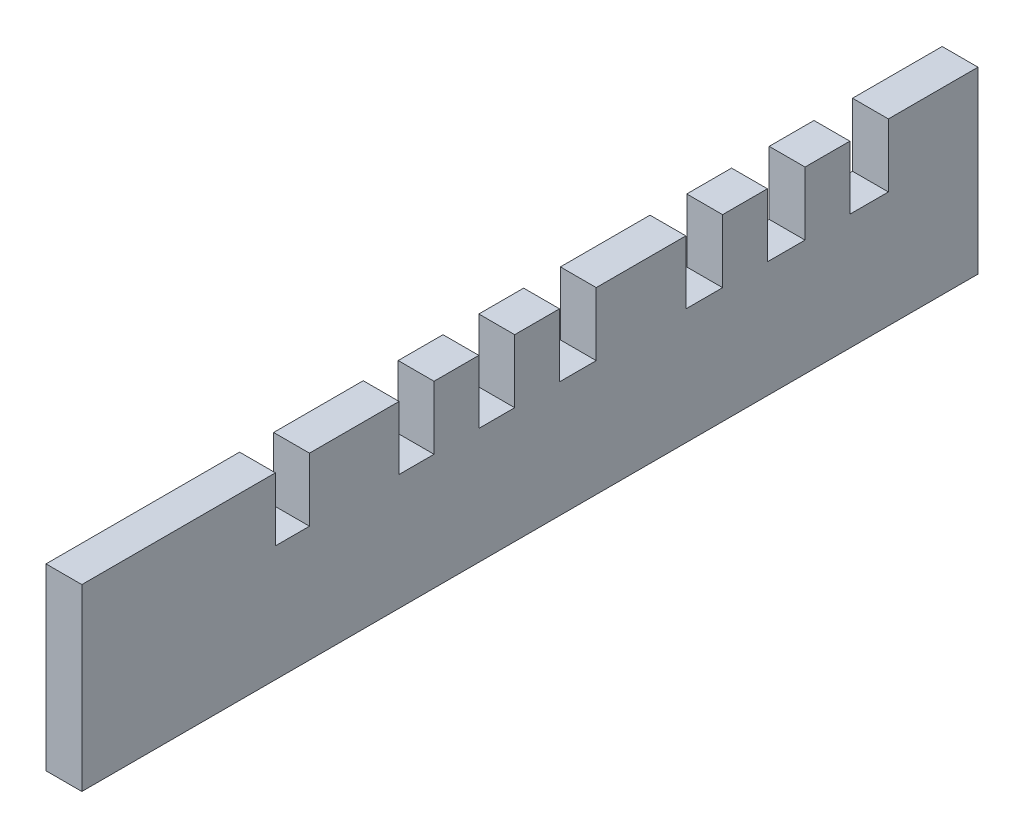
ISO-10303-21;
HEADER;
FILE_DESCRIPTION(('STEP AP214'),'2;1');
FILE_NAME('part.step','',(''),(''),'','','');
FILE_SCHEMA(('AUTOMOTIVE_DESIGN { 1 0 10303 214 1 1 1 1 }'));
ENDSEC;
DATA;
#1=APPLICATION_CONTEXT('core data for automotive mechanical design processes');
#2=APPLICATION_PROTOCOL_DEFINITION('international standard','automotive_design',2000,#1);
#3=PRODUCT_CONTEXT('',#1,'mechanical');
#4=PRODUCT('Part','Part','',(#3));
#5=PRODUCT_RELATED_PRODUCT_CATEGORY('part','',(#4));
#6=PRODUCT_DEFINITION_FORMATION('','',#4);
#7=PRODUCT_DEFINITION_CONTEXT('part definition',#1,'design');
#8=PRODUCT_DEFINITION('design','',#6,#7);
#9=PRODUCT_DEFINITION_SHAPE('','',#8);
#10=(LENGTH_UNIT() NAMED_UNIT(*) SI_UNIT(.MILLI.,.METRE.));
#11=(NAMED_UNIT(*) PLANE_ANGLE_UNIT() SI_UNIT($,.RADIAN.));
#12=(NAMED_UNIT(*) SI_UNIT($,.STERADIAN.) SOLID_ANGLE_UNIT());
#13=UNCERTAINTY_MEASURE_WITH_UNIT(LENGTH_MEASURE(1.E-05),#10,'distance_accuracy_value','');
#14=(GEOMETRIC_REPRESENTATION_CONTEXT(3) GLOBAL_UNCERTAINTY_ASSIGNED_CONTEXT((#13)) GLOBAL_UNIT_ASSIGNED_CONTEXT((#10,
#11,#12)) REPRESENTATION_CONTEXT('',''));
#15=CARTESIAN_POINT('',(0.,0.,0.));
#16=DIRECTION('',(0.,0.,1.));
#17=DIRECTION('',(1.,0.,0.));
#18=AXIS2_PLACEMENT_3D('',#15,#16,#17);
#19=CARTESIAN_POINT('',(0.,25.4,127.));
#20=DIRECTION('',(0.,-1.,0.));
#21=DIRECTION('',(0.,0.,-1.));
#22=AXIS2_PLACEMENT_3D('',#19,#20,#21);
#23=PLANE('',#22);
#24=DIRECTION('',(0.,0.,-1.));
#25=VECTOR('',#24,1.);
#26=CARTESIAN_POINT('',(0.,25.4,127.));
#27=LINE('',#26,#25);
#28=CARTESIAN_POINT('',(0.,25.4,12.7));
#29=VERTEX_POINT('',#28);
#30=CARTESIAN_POINT('',(0.,25.4,0.));
#31=VERTEX_POINT('',#30);
#32=EDGE_CURVE('E272',#29,#31,#27,.T.);
#33=ORIENTED_EDGE('',*,*,#32,.F.);
#34=DIRECTION('',(1.,0.,0.));
#35=VECTOR('',#34,1.);
#36=CARTESIAN_POINT('',(0.,25.4,12.7));
#37=LINE('',#36,#35);
#38=CARTESIAN_POINT('',(5.08,25.4,12.7));
#39=VERTEX_POINT('',#38);
#40=EDGE_CURVE('E12',#29,#39,#37,.T.);
#41=ORIENTED_EDGE('',*,*,#40,.T.);
#42=DIRECTION('',(0.,0.,-1.));
#43=VECTOR('',#42,1.);
#44=CARTESIAN_POINT('',(5.08,25.4,127.));
#45=LINE('',#44,#43);
#46=CARTESIAN_POINT('',(5.08,25.4,0.));
#47=VERTEX_POINT('',#46);
#48=EDGE_CURVE('E270',#39,#47,#45,.T.);
#49=ORIENTED_EDGE('',*,*,#48,.T.);
#50=DIRECTION('',(-1.,0.,0.));
#51=VECTOR('',#50,1.);
#52=CARTESIAN_POINT('',(0.,25.4,0.));
#53=LINE('',#52,#51);
#54=EDGE_CURVE('E482',#47,#31,#53,.T.);
#55=ORIENTED_EDGE('',*,*,#54,.T.);
#56=EDGE_LOOP('',(#33,#41,#49,#55));
#57=FACE_BOUND('',#56,.T.);
#58=ADVANCED_FACE('F44',(#57),#23,.F.);
#59=CARTESIAN_POINT('',(5.08,25.4,24.511));
#60=VERTEX_POINT('',#59);
#61=CARTESIAN_POINT('',(5.08,25.4,18.161));
#62=VERTEX_POINT('',#61);
#63=EDGE_CURVE('E279',#60,#62,#45,.T.);
#64=ORIENTED_EDGE('',*,*,#63,.T.);
#65=DIRECTION('',(-1.,0.,0.));
#66=VECTOR('',#65,1.);
#67=CARTESIAN_POINT('',(0.,25.4,18.161));
#68=LINE('',#67,#66);
#69=CARTESIAN_POINT('',(0.,25.4,18.161));
#70=VERTEX_POINT('',#69);
#71=EDGE_CURVE('E52',#62,#70,#68,.T.);
#72=ORIENTED_EDGE('',*,*,#71,.T.);
#73=CARTESIAN_POINT('',(0.,25.4,24.511));
#74=VERTEX_POINT('',#73);
#75=EDGE_CURVE('E595',#74,#70,#27,.T.);
#76=ORIENTED_EDGE('',*,*,#75,.F.);
#77=DIRECTION('',(1.,0.,0.));
#78=VECTOR('',#77,1.);
#79=CARTESIAN_POINT('',(0.,25.4,24.511));
#80=LINE('',#79,#78);
#81=EDGE_CURVE('E589',#74,#60,#80,.T.);
#82=ORIENTED_EDGE('',*,*,#81,.T.);
#83=EDGE_LOOP('',(#64,#72,#76,#82));
#84=FACE_BOUND('',#83,.T.);
#85=ADVANCED_FACE('F594',(#84),#23,.F.);
#86=CARTESIAN_POINT('',(5.08,25.4,36.195));
#87=VERTEX_POINT('',#86);
#88=CARTESIAN_POINT('',(5.08,25.4,29.845));
#89=VERTEX_POINT('',#88);
#90=EDGE_CURVE('E285',#87,#89,#45,.T.);
#91=ORIENTED_EDGE('',*,*,#90,.T.);
#92=DIRECTION('',(-1.,0.,0.));
#93=VECTOR('',#92,1.);
#94=CARTESIAN_POINT('',(0.,25.4,29.845));
#95=LINE('',#94,#93);
#96=CARTESIAN_POINT('',(0.,25.4,29.845));
#97=VERTEX_POINT('',#96);
#98=EDGE_CURVE('E347',#89,#97,#95,.T.);
#99=ORIENTED_EDGE('',*,*,#98,.T.);
#100=CARTESIAN_POINT('',(0.,25.4,36.195));
#101=VERTEX_POINT('',#100);
#102=EDGE_CURVE('E600',#101,#97,#27,.T.);
#103=ORIENTED_EDGE('',*,*,#102,.F.);
#104=DIRECTION('',(1.,0.,0.));
#105=VECTOR('',#104,1.);
#106=CARTESIAN_POINT('',(0.,25.4,36.195));
#107=LINE('',#106,#105);
#108=EDGE_CURVE('E349',#101,#87,#107,.T.);
#109=ORIENTED_EDGE('',*,*,#108,.T.);
#110=EDGE_LOOP('',(#91,#99,#103,#109));
#111=FACE_BOUND('',#110,.T.);
#112=ADVANCED_FACE('F345',(#111),#23,.F.);
#113=CARTESIAN_POINT('',(5.08,25.4,54.102));
#114=VERTEX_POINT('',#113);
#115=CARTESIAN_POINT('',(5.08,25.4,41.402));
#116=VERTEX_POINT('',#115);
#117=EDGE_CURVE('E323',#114,#116,#45,.T.);
#118=ORIENTED_EDGE('',*,*,#117,.T.);
#119=DIRECTION('',(-1.,0.,0.));
#120=VECTOR('',#119,1.);
#121=CARTESIAN_POINT('',(0.,25.4,41.402));
#122=LINE('',#121,#120);
#123=CARTESIAN_POINT('',(0.,25.4,41.402));
#124=VERTEX_POINT('',#123);
#125=EDGE_CURVE('E585',#116,#124,#122,.T.);
#126=ORIENTED_EDGE('',*,*,#125,.T.);
#127=CARTESIAN_POINT('',(0.,25.4,54.102));
#128=VERTEX_POINT('',#127);
#129=EDGE_CURVE('E601',#128,#124,#27,.T.);
#130=ORIENTED_EDGE('',*,*,#129,.F.);
#131=DIRECTION('',(1.,0.,0.));
#132=VECTOR('',#131,1.);
#133=CARTESIAN_POINT('',(0.,25.4,54.102));
#134=LINE('',#133,#132);
#135=EDGE_CURVE('E583',#128,#114,#134,.T.);
#136=ORIENTED_EDGE('',*,*,#135,.T.);
#137=EDGE_LOOP('',(#118,#126,#130,#136));
#138=FACE_BOUND('',#137,.T.);
#139=ADVANCED_FACE('F645',(#138),#23,.F.);
#140=CARTESIAN_POINT('',(5.08,25.4,65.659));
#141=VERTEX_POINT('',#140);
#142=CARTESIAN_POINT('',(5.08,25.4,59.309));
#143=VERTEX_POINT('',#142);
#144=EDGE_CURVE('E314',#141,#143,#45,.T.);
#145=ORIENTED_EDGE('',*,*,#144,.T.);
#146=DIRECTION('',(-1.,0.,0.));
#147=VECTOR('',#146,1.);
#148=CARTESIAN_POINT('',(0.,25.4,59.309));
#149=LINE('',#148,#147);
#150=CARTESIAN_POINT('',(0.,25.4,59.309));
#151=VERTEX_POINT('',#150);
#152=EDGE_CURVE('E581',#143,#151,#149,.T.);
#153=ORIENTED_EDGE('',*,*,#152,.T.);
#154=CARTESIAN_POINT('',(0.,25.4,65.659));
#155=VERTEX_POINT('',#154);
#156=EDGE_CURVE('E647',#155,#151,#27,.T.);
#157=ORIENTED_EDGE('',*,*,#156,.F.);
#158=DIRECTION('',(1.,0.,0.));
#159=VECTOR('',#158,1.);
#160=CARTESIAN_POINT('',(0.,25.4,65.659));
#161=LINE('',#160,#159);
#162=EDGE_CURVE('E579',#155,#141,#161,.T.);
#163=ORIENTED_EDGE('',*,*,#162,.T.);
#164=EDGE_LOOP('',(#145,#153,#157,#163));
#165=FACE_BOUND('',#164,.T.);
#166=ADVANCED_FACE('F663',(#165),#23,.F.);
#167=CARTESIAN_POINT('',(5.08,25.4,77.089));
#168=VERTEX_POINT('',#167);
#169=CARTESIAN_POINT('',(5.08,25.4,70.739));
#170=VERTEX_POINT('',#169);
#171=EDGE_CURVE('E305',#168,#170,#45,.T.);
#172=ORIENTED_EDGE('',*,*,#171,.T.);
#173=DIRECTION('',(-1.,0.,0.));
#174=VECTOR('',#173,1.);
#175=CARTESIAN_POINT('',(0.,25.4,70.739));
#176=LINE('',#175,#174);
#177=CARTESIAN_POINT('',(0.,25.4,70.739));
#178=VERTEX_POINT('',#177);
#179=EDGE_CURVE('E572',#170,#178,#176,.T.);
#180=ORIENTED_EDGE('',*,*,#179,.T.);
#181=CARTESIAN_POINT('',(0.,25.4,77.089));
#182=VERTEX_POINT('',#181);
#183=EDGE_CURVE('E649',#182,#178,#27,.T.);
#184=ORIENTED_EDGE('',*,*,#183,.F.);
#185=DIRECTION('',(1.,0.,0.));
#186=VECTOR('',#185,1.);
#187=CARTESIAN_POINT('',(0.,25.4,77.089));
#188=LINE('',#187,#186);
#189=EDGE_CURVE('E569',#182,#168,#188,.T.);
#190=ORIENTED_EDGE('',*,*,#189,.T.);
#191=EDGE_LOOP('',(#172,#180,#184,#190));
#192=FACE_BOUND('',#191,.T.);
#193=ADVANCED_FACE('F655',(#192),#23,.F.);
#194=CARTESIAN_POINT('',(5.08,25.4,94.742));
#195=VERTEX_POINT('',#194);
#196=CARTESIAN_POINT('',(5.08,25.4,82.042));
#197=VERTEX_POINT('',#196);
#198=EDGE_CURVE('E294',#195,#197,#45,.T.);
#199=ORIENTED_EDGE('',*,*,#198,.T.);
#200=DIRECTION('',(-1.,0.,0.));
#201=VECTOR('',#200,1.);
#202=CARTESIAN_POINT('',(0.,25.4,82.042));
#203=LINE('',#202,#201);
#204=CARTESIAN_POINT('',(0.,25.4,82.042));
#205=VERTEX_POINT('',#204);
#206=EDGE_CURVE('E566',#197,#205,#203,.T.);
#207=ORIENTED_EDGE('',*,*,#206,.T.);
#208=CARTESIAN_POINT('',(0.,25.4,94.742));
#209=VERTEX_POINT('',#208);
#210=EDGE_CURVE('E287',#209,#205,#27,.T.);
#211=ORIENTED_EDGE('',*,*,#210,.F.);
#212=DIRECTION('',(1.,0.,0.));
#213=VECTOR('',#212,1.);
#214=CARTESIAN_POINT('',(0.,25.4,94.742));
#215=LINE('',#214,#213);
#216=EDGE_CURVE('E570',#209,#195,#215,.T.);
#217=ORIENTED_EDGE('',*,*,#216,.T.);
#218=EDGE_LOOP('',(#199,#207,#211,#217));
#219=FACE_BOUND('',#218,.T.);
#220=ADVANCED_FACE('F653',(#219),#23,.F.);
#221=CARTESIAN_POINT('',(0.,0.,127.));
#222=DIRECTION('',(1.,0.,0.));
#223=DIRECTION('',(0.,0.,-1.));
#224=AXIS2_PLACEMENT_3D('',#221,#222,#223);
#225=PLANE('',#224);
#226=DIRECTION('',(0.,0.,-1.));
#227=VECTOR('',#226,1.);
#228=CARTESIAN_POINT('',(0.,16.4345145057894,127.));
#229=LINE('',#228,#227);
#230=CARTESIAN_POINT('',(0.,16.4345145057894,18.161));
#231=VERTEX_POINT('',#230);
#232=CARTESIAN_POINT('',(0.,16.4345145057894,12.7));
#233=VERTEX_POINT('',#232);
#234=EDGE_CURVE('E478',#231,#233,#229,.T.);
#235=ORIENTED_EDGE('',*,*,#234,.T.);
#236=DIRECTION('',(0.,1.,0.));
#237=VECTOR('',#236,1.);
#238=CARTESIAN_POINT('',(0.,0.,12.7));
#239=LINE('',#238,#237);
#240=EDGE_CURVE('E510',#233,#29,#239,.T.);
#241=ORIENTED_EDGE('',*,*,#240,.T.);
#242=ORIENTED_EDGE('',*,*,#32,.T.);
#243=DIRECTION('',(0.,-1.,0.));
#244=VECTOR('',#243,1.);
#245=CARTESIAN_POINT('',(0.,0.,0.));
#246=LINE('',#245,#244);
#247=CARTESIAN_POINT('',(0.,0.,0.));
#248=VERTEX_POINT('',#247);
#249=EDGE_CURVE('E474',#31,#248,#246,.T.);
#250=ORIENTED_EDGE('',*,*,#249,.T.);
#251=DIRECTION('',(0.,0.,-1.));
#252=VECTOR('',#251,1.);
#253=CARTESIAN_POINT('',(0.,0.,127.));
#254=LINE('',#253,#252);
#255=CARTESIAN_POINT('',(0.,0.,127.));
#256=VERTEX_POINT('',#255);
#257=EDGE_CURVE('E302',#256,#248,#254,.T.);
#258=ORIENTED_EDGE('',*,*,#257,.F.);
#259=DIRECTION('',(0.,-1.,0.));
#260=VECTOR('',#259,1.);
#261=CARTESIAN_POINT('',(0.,0.,127.));
#262=LINE('',#261,#260);
#263=CARTESIAN_POINT('',(0.,25.4,127.));
#264=VERTEX_POINT('',#263);
#265=EDGE_CURVE('E483',#264,#256,#262,.T.);
#266=ORIENTED_EDGE('',*,*,#265,.F.);
#267=CARTESIAN_POINT('',(0.,25.4,99.568));
#268=VERTEX_POINT('',#267);
#269=EDGE_CURVE('E280',#264,#268,#27,.T.);
#270=ORIENTED_EDGE('',*,*,#269,.T.);
#271=DIRECTION('',(0.,-1.,0.));
#272=VECTOR('',#271,1.);
#273=CARTESIAN_POINT('',(0.,0.,99.568));
#274=LINE('',#273,#272);
#275=CARTESIAN_POINT('',(0.,16.4345145057894,99.568));
#276=VERTEX_POINT('',#275);
#277=EDGE_CURVE('E544',#268,#276,#274,.T.);
#278=ORIENTED_EDGE('',*,*,#277,.T.);
#279=DIRECTION('',(0.,0.,-1.));
#280=VECTOR('',#279,1.);
#281=CARTESIAN_POINT('',(0.,16.4345145057894,127.));
#282=LINE('',#281,#280);
#283=CARTESIAN_POINT('',(0.,16.4345145057894,94.742));
#284=VERTEX_POINT('',#283);
#285=EDGE_CURVE('E507',#276,#284,#282,.T.);
#286=ORIENTED_EDGE('',*,*,#285,.T.);
#287=DIRECTION('',(0.,1.,0.));
#288=VECTOR('',#287,1.);
#289=CARTESIAN_POINT('',(0.,0.,94.742));
#290=LINE('',#289,#288);
#291=EDGE_CURVE('E541',#284,#209,#290,.T.);
#292=ORIENTED_EDGE('',*,*,#291,.T.);
#293=ORIENTED_EDGE('',*,*,#210,.T.);
#294=DIRECTION('',(0.,-1.,0.));
#295=VECTOR('',#294,1.);
#296=CARTESIAN_POINT('',(0.,0.,82.0419999999999));
#297=LINE('',#296,#295);
#298=CARTESIAN_POINT('',(0.,16.4345145057894,82.042));
#299=VERTEX_POINT('',#298);
#300=EDGE_CURVE('E538',#205,#299,#297,.T.);
#301=ORIENTED_EDGE('',*,*,#300,.T.);
#302=DIRECTION('',(0.,0.,-1.));
#303=VECTOR('',#302,1.);
#304=CARTESIAN_POINT('',(0.,16.4345145057894,127.));
#305=LINE('',#304,#303);
#306=CARTESIAN_POINT('',(0.,16.4345145057894,77.089));
#307=VERTEX_POINT('',#306);
#308=EDGE_CURVE('E504',#299,#307,#305,.T.);
#309=ORIENTED_EDGE('',*,*,#308,.T.);
#310=DIRECTION('',(0.,1.,0.));
#311=VECTOR('',#310,1.);
#312=CARTESIAN_POINT('',(0.,0.,77.089));
#313=LINE('',#312,#311);
#314=EDGE_CURVE('E535',#307,#182,#313,.T.);
#315=ORIENTED_EDGE('',*,*,#314,.T.);
#316=ORIENTED_EDGE('',*,*,#183,.T.);
#317=DIRECTION('',(0.,-1.,0.));
#318=VECTOR('',#317,1.);
#319=CARTESIAN_POINT('',(0.,0.,70.739));
#320=LINE('',#319,#318);
#321=CARTESIAN_POINT('',(0.,16.4345145057894,70.739));
#322=VERTEX_POINT('',#321);
#323=EDGE_CURVE('E532',#178,#322,#320,.T.);
#324=ORIENTED_EDGE('',*,*,#323,.T.);
#325=DIRECTION('',(0.,0.,-1.));
#326=VECTOR('',#325,1.);
#327=CARTESIAN_POINT('',(0.,16.4345145057894,127.));
#328=LINE('',#327,#326);
#329=CARTESIAN_POINT('',(0.,16.4345145057894,65.659));
#330=VERTEX_POINT('',#329);
#331=EDGE_CURVE('E501',#322,#330,#328,.T.);
#332=ORIENTED_EDGE('',*,*,#331,.T.);
#333=DIRECTION('',(0.,1.,0.));
#334=VECTOR('',#333,1.);
#335=CARTESIAN_POINT('',(0.,0.,65.659));
#336=LINE('',#335,#334);
#337=EDGE_CURVE('E529',#330,#155,#336,.T.);
#338=ORIENTED_EDGE('',*,*,#337,.T.);
#339=ORIENTED_EDGE('',*,*,#156,.T.);
#340=DIRECTION('',(0.,-1.,0.));
#341=VECTOR('',#340,1.);
#342=CARTESIAN_POINT('',(0.,0.,59.309));
#343=LINE('',#342,#341);
#344=CARTESIAN_POINT('',(0.,16.4345145057894,59.309));
#345=VERTEX_POINT('',#344);
#346=EDGE_CURVE('E526',#151,#345,#343,.T.);
#347=ORIENTED_EDGE('',*,*,#346,.T.);
#348=DIRECTION('',(0.,0.,-1.));
#349=VECTOR('',#348,1.);
#350=CARTESIAN_POINT('',(0.,16.4345145057894,127.));
#351=LINE('',#350,#349);
#352=CARTESIAN_POINT('',(0.,16.4345145057894,54.102));
#353=VERTEX_POINT('',#352);
#354=EDGE_CURVE('E498',#345,#353,#351,.T.);
#355=ORIENTED_EDGE('',*,*,#354,.T.);
#356=DIRECTION('',(0.,1.,0.));
#357=VECTOR('',#356,1.);
#358=CARTESIAN_POINT('',(0.,0.,54.102));
#359=LINE('',#358,#357);
#360=EDGE_CURVE('E523',#353,#128,#359,.T.);
#361=ORIENTED_EDGE('',*,*,#360,.T.);
#362=ORIENTED_EDGE('',*,*,#129,.T.);
#363=DIRECTION('',(0.,-1.,0.));
#364=VECTOR('',#363,1.);
#365=CARTESIAN_POINT('',(0.,0.,41.402));
#366=LINE('',#365,#364);
#367=CARTESIAN_POINT('',(0.,16.4345145057894,41.402));
#368=VERTEX_POINT('',#367);
#369=EDGE_CURVE('E520',#124,#368,#366,.T.);
#370=ORIENTED_EDGE('',*,*,#369,.T.);
#371=DIRECTION('',(0.,0.,-1.));
#372=VECTOR('',#371,1.);
#373=CARTESIAN_POINT('',(0.,16.4345145057894,127.));
#374=LINE('',#373,#372);
#375=CARTESIAN_POINT('',(0.,16.4345145057894,36.195));
#376=VERTEX_POINT('',#375);
#377=EDGE_CURVE('E495',#368,#376,#374,.T.);
#378=ORIENTED_EDGE('',*,*,#377,.T.);
#379=DIRECTION('',(0.,1.,0.));
#380=VECTOR('',#379,1.);
#381=CARTESIAN_POINT('',(0.,0.,36.195));
#382=LINE('',#381,#380);
#383=EDGE_CURVE('E517',#376,#101,#382,.T.);
#384=ORIENTED_EDGE('',*,*,#383,.T.);
#385=ORIENTED_EDGE('',*,*,#102,.T.);
#386=DIRECTION('',(0.,-1.,0.));
#387=VECTOR('',#386,1.);
#388=CARTESIAN_POINT('',(0.,0.,29.845));
#389=LINE('',#388,#387);
#390=CARTESIAN_POINT('',(0.,16.4345145057894,29.845));
#391=VERTEX_POINT('',#390);
#392=EDGE_CURVE('E67',#97,#391,#389,.T.);
#393=ORIENTED_EDGE('',*,*,#392,.T.);
#394=DIRECTION('',(0.,0.,-1.));
#395=VECTOR('',#394,1.);
#396=CARTESIAN_POINT('',(0.,16.4345145057894,127.));
#397=LINE('',#396,#395);
#398=CARTESIAN_POINT('',(0.,16.4345145057894,24.511));
#399=VERTEX_POINT('',#398);
#400=EDGE_CURVE('E492',#391,#399,#397,.T.);
#401=ORIENTED_EDGE('',*,*,#400,.T.);
#402=DIRECTION('',(0.,1.,0.));
#403=VECTOR('',#402,1.);
#404=CARTESIAN_POINT('',(0.,0.,24.511));
#405=LINE('',#404,#403);
#406=EDGE_CURVE('E513',#399,#74,#405,.T.);
#407=ORIENTED_EDGE('',*,*,#406,.T.);
#408=ORIENTED_EDGE('',*,*,#75,.T.);
#409=DIRECTION('',(0.,-1.,0.));
#410=VECTOR('',#409,1.);
#411=CARTESIAN_POINT('',(0.,0.,18.161));
#412=LINE('',#411,#410);
#413=EDGE_CURVE('E59',#70,#231,#412,.T.);
#414=ORIENTED_EDGE('',*,*,#413,.T.);
#415=EDGE_LOOP('',(#235,#241,#242,#250,#258,#266,#270,#278,#286,#292,#293,#301,#309,#315,#316,
#324,#332,#338,#339,#347,#355,#361,#362,#370,#378,#384,#385,#393,#401,#407,#408,#414));
#416=FACE_BOUND('',#415,.T.);
#417=ADVANCED_FACE('F46',(#416),#225,.F.);
#418=CARTESIAN_POINT('',(0.,0.,127.));
#419=DIRECTION('',(0.,1.,0.));
#420=DIRECTION('',(0.,0.,1.));
#421=AXIS2_PLACEMENT_3D('',#418,#419,#420);
#422=PLANE('',#421);
#423=DIRECTION('',(1.,0.,0.));
#424=VECTOR('',#423,1.);
#425=CARTESIAN_POINT('',(0.,0.,0.));
#426=LINE('',#425,#424);
#427=CARTESIAN_POINT('',(5.08,0.,0.));
#428=VERTEX_POINT('',#427);
#429=EDGE_CURVE('E477',#248,#428,#426,.T.);
#430=ORIENTED_EDGE('',*,*,#429,.T.);
#431=DIRECTION('',(0.,0.,-1.));
#432=VECTOR('',#431,1.);
#433=CARTESIAN_POINT('',(5.08,0.,127.));
#434=LINE('',#433,#432);
#435=CARTESIAN_POINT('',(5.08,0.,127.));
#436=VERTEX_POINT('',#435);
#437=EDGE_CURVE('E293',#436,#428,#434,.T.);
#438=ORIENTED_EDGE('',*,*,#437,.F.);
#439=DIRECTION('',(1.,0.,0.));
#440=VECTOR('',#439,1.);
#441=CARTESIAN_POINT('',(0.,0.,127.));
#442=LINE('',#441,#440);
#443=EDGE_CURVE('E471',#256,#436,#442,.T.);
#444=ORIENTED_EDGE('',*,*,#443,.F.);
#445=ORIENTED_EDGE('',*,*,#257,.T.);
#446=EDGE_LOOP('',(#430,#438,#444,#445));
#447=FACE_BOUND('',#446,.T.);
#448=ADVANCED_FACE('F662',(#447),#422,.F.);
#449=CARTESIAN_POINT('',(5.08,0.,127.));
#450=DIRECTION('',(-1.,0.,0.));
#451=DIRECTION('',(0.,0.,1.));
#452=AXIS2_PLACEMENT_3D('',#449,#450,#451);
#453=PLANE('',#452);
#454=ORIENTED_EDGE('',*,*,#48,.F.);
#455=DIRECTION('',(0.,1.,0.));
#456=VECTOR('',#455,1.);
#457=CARTESIAN_POINT('',(5.08,25.4,12.7));
#458=LINE('',#457,#456);
#459=CARTESIAN_POINT('',(5.08,16.4345145057894,12.7));
#460=VERTEX_POINT('',#459);
#461=EDGE_CURVE('E254',#460,#39,#458,.T.);
#462=ORIENTED_EDGE('',*,*,#461,.F.);
#463=DIRECTION('',(0.,0.,-1.));
#464=VECTOR('',#463,1.);
#465=CARTESIAN_POINT('',(5.08,16.4345145057894,12.7));
#466=LINE('',#465,#464);
#467=CARTESIAN_POINT('',(5.08,16.4345145057894,18.161));
#468=VERTEX_POINT('',#467);
#469=EDGE_CURVE('E604',#468,#460,#466,.T.);
#470=ORIENTED_EDGE('',*,*,#469,.F.);
#471=DIRECTION('',(0.,-1.,0.));
#472=VECTOR('',#471,1.);
#473=CARTESIAN_POINT('',(5.08,25.4,18.161));
#474=LINE('',#473,#472);
#475=EDGE_CURVE('E264',#62,#468,#474,.T.);
#476=ORIENTED_EDGE('',*,*,#475,.F.);
#477=ORIENTED_EDGE('',*,*,#63,.F.);
#478=DIRECTION('',(0.,1.,0.));
#479=VECTOR('',#478,1.);
#480=CARTESIAN_POINT('',(5.08,25.4,24.511));
#481=LINE('',#480,#479);
#482=CARTESIAN_POINT('',(5.08,16.4345145057894,24.511));
#483=VERTEX_POINT('',#482);
#484=EDGE_CURVE('E360',#483,#60,#481,.T.);
#485=ORIENTED_EDGE('',*,*,#484,.F.);
#486=DIRECTION('',(0.,0.,-1.));
#487=VECTOR('',#486,1.);
#488=CARTESIAN_POINT('',(5.08,16.4345145057894,24.511));
#489=LINE('',#488,#487);
#490=CARTESIAN_POINT('',(5.08,16.4345145057894,29.845));
#491=VERTEX_POINT('',#490);
#492=EDGE_CURVE('E359',#491,#483,#489,.T.);
#493=ORIENTED_EDGE('',*,*,#492,.F.);
#494=DIRECTION('',(0.,-1.,0.));
#495=VECTOR('',#494,1.);
#496=CARTESIAN_POINT('',(5.08,25.4,29.845));
#497=LINE('',#496,#495);
#498=EDGE_CURVE('E356',#89,#491,#497,.T.);
#499=ORIENTED_EDGE('',*,*,#498,.F.);
#500=ORIENTED_EDGE('',*,*,#90,.F.);
#501=DIRECTION('',(0.,1.,0.));
#502=VECTOR('',#501,1.);
#503=CARTESIAN_POINT('',(5.08,25.4,36.195));
#504=LINE('',#503,#502);
#505=CARTESIAN_POINT('',(5.08,16.4345145057894,36.195));
#506=VERTEX_POINT('',#505);
#507=EDGE_CURVE('E353',#506,#87,#504,.T.);
#508=ORIENTED_EDGE('',*,*,#507,.F.);
#509=DIRECTION('',(0.,0.,-1.));
#510=VECTOR('',#509,1.);
#511=CARTESIAN_POINT('',(5.08,16.4345145057894,36.195));
#512=LINE('',#511,#510);
#513=CARTESIAN_POINT('',(5.08,16.4345145057894,41.402));
#514=VERTEX_POINT('',#513);
#515=EDGE_CURVE('E389',#514,#506,#512,.T.);
#516=ORIENTED_EDGE('',*,*,#515,.F.);
#517=DIRECTION('',(0.,-1.,0.));
#518=VECTOR('',#517,1.);
#519=CARTESIAN_POINT('',(5.08,25.4,41.402));
#520=LINE('',#519,#518);
#521=EDGE_CURVE('E385',#116,#514,#520,.T.);
#522=ORIENTED_EDGE('',*,*,#521,.F.);
#523=ORIENTED_EDGE('',*,*,#117,.F.);
#524=DIRECTION('',(0.,1.,0.));
#525=VECTOR('',#524,1.);
#526=CARTESIAN_POINT('',(5.08,25.4,54.102));
#527=LINE('',#526,#525);
#528=CARTESIAN_POINT('',(5.08,16.4345145057894,54.102));
#529=VERTEX_POINT('',#528);
#530=EDGE_CURVE('E398',#529,#114,#527,.T.);
#531=ORIENTED_EDGE('',*,*,#530,.F.);
#532=DIRECTION('',(0.,0.,-1.));
#533=VECTOR('',#532,1.);
#534=CARTESIAN_POINT('',(5.08,16.4345145057894,54.102));
#535=LINE('',#534,#533);
#536=CARTESIAN_POINT('',(5.08,16.4345145057894,59.309));
#537=VERTEX_POINT('',#536);
#538=EDGE_CURVE('E407',#537,#529,#535,.T.);
#539=ORIENTED_EDGE('',*,*,#538,.F.);
#540=DIRECTION('',(0.,-1.,0.));
#541=VECTOR('',#540,1.);
#542=CARTESIAN_POINT('',(5.08,25.4,59.309));
#543=LINE('',#542,#541);
#544=EDGE_CURVE('E402',#143,#537,#543,.T.);
#545=ORIENTED_EDGE('',*,*,#544,.F.);
#546=ORIENTED_EDGE('',*,*,#144,.F.);
#547=DIRECTION('',(0.,1.,0.));
#548=VECTOR('',#547,1.);
#549=CARTESIAN_POINT('',(5.08,25.4,65.659));
#550=LINE('',#549,#548);
#551=CARTESIAN_POINT('',(5.08,16.4345145057894,65.659));
#552=VERTEX_POINT('',#551);
#553=EDGE_CURVE('E416',#552,#141,#550,.T.);
#554=ORIENTED_EDGE('',*,*,#553,.F.);
#555=DIRECTION('',(0.,0.,-1.));
#556=VECTOR('',#555,1.);
#557=CARTESIAN_POINT('',(5.08,16.4345145057894,65.659));
#558=LINE('',#557,#556);
#559=CARTESIAN_POINT('',(5.08,16.4345145057894,70.739));
#560=VERTEX_POINT('',#559);
#561=EDGE_CURVE('E425',#560,#552,#558,.T.);
#562=ORIENTED_EDGE('',*,*,#561,.F.);
#563=DIRECTION('',(0.,-1.,0.));
#564=VECTOR('',#563,1.);
#565=CARTESIAN_POINT('',(5.08,25.4,70.739));
#566=LINE('',#565,#564);
#567=EDGE_CURVE('E420',#170,#560,#566,.T.);
#568=ORIENTED_EDGE('',*,*,#567,.F.);
#569=ORIENTED_EDGE('',*,*,#171,.F.);
#570=DIRECTION('',(0.,1.,0.));
#571=VECTOR('',#570,1.);
#572=CARTESIAN_POINT('',(5.08,25.4,77.089));
#573=LINE('',#572,#571);
#574=CARTESIAN_POINT('',(5.08,16.4345145057894,77.089));
#575=VERTEX_POINT('',#574);
#576=EDGE_CURVE('E434',#575,#168,#573,.T.);
#577=ORIENTED_EDGE('',*,*,#576,.F.);
#578=DIRECTION('',(0.,0.,-1.));
#579=VECTOR('',#578,1.);
#580=CARTESIAN_POINT('',(5.08,16.4345145057894,77.089));
#581=LINE('',#580,#579);
#582=CARTESIAN_POINT('',(5.08,16.4345145057894,82.042));
#583=VERTEX_POINT('',#582);
#584=EDGE_CURVE('E443',#583,#575,#581,.T.);
#585=ORIENTED_EDGE('',*,*,#584,.F.);
#586=DIRECTION('',(0.,-1.,0.));
#587=VECTOR('',#586,1.);
#588=CARTESIAN_POINT('',(5.08,25.4,82.042));
#589=LINE('',#588,#587);
#590=EDGE_CURVE('E438',#197,#583,#589,.T.);
#591=ORIENTED_EDGE('',*,*,#590,.F.);
#592=ORIENTED_EDGE('',*,*,#198,.F.);
#593=DIRECTION('',(0.,1.,0.));
#594=VECTOR('',#593,1.);
#595=CARTESIAN_POINT('',(5.08,25.4,94.742));
#596=LINE('',#595,#594);
#597=CARTESIAN_POINT('',(5.08,16.4345145057894,94.742));
#598=VERTEX_POINT('',#597);
#599=EDGE_CURVE('E452',#598,#195,#596,.T.);
#600=ORIENTED_EDGE('',*,*,#599,.F.);
#601=DIRECTION('',(0.,0.,-1.));
#602=VECTOR('',#601,1.);
#603=CARTESIAN_POINT('',(5.08,16.4345145057894,94.742));
#604=LINE('',#603,#602);
#605=CARTESIAN_POINT('',(5.08,16.4345145057894,99.568));
#606=VERTEX_POINT('',#605);
#607=EDGE_CURVE('E460',#606,#598,#604,.T.);
#608=ORIENTED_EDGE('',*,*,#607,.F.);
#609=DIRECTION('',(0.,-1.,0.));
#610=VECTOR('',#609,1.);
#611=CARTESIAN_POINT('',(5.08,25.4,99.568));
#612=LINE('',#611,#610);
#613=CARTESIAN_POINT('',(5.08,25.4,99.568));
#614=VERTEX_POINT('',#613);
#615=EDGE_CURVE('E456',#614,#606,#612,.T.);
#616=ORIENTED_EDGE('',*,*,#615,.F.);
#617=CARTESIAN_POINT('',(5.08,25.4,127.));
#618=VERTEX_POINT('',#617);
#619=EDGE_CURVE('E282',#618,#614,#45,.T.);
#620=ORIENTED_EDGE('',*,*,#619,.F.);
#621=DIRECTION('',(0.,1.,0.));
#622=VECTOR('',#621,1.);
#623=CARTESIAN_POINT('',(5.08,0.,127.));
#624=LINE('',#623,#622);
#625=EDGE_CURVE('E466',#436,#618,#624,.T.);
#626=ORIENTED_EDGE('',*,*,#625,.F.);
#627=ORIENTED_EDGE('',*,*,#437,.T.);
#628=DIRECTION('',(0.,1.,0.));
#629=VECTOR('',#628,1.);
#630=CARTESIAN_POINT('',(5.08,0.,0.));
#631=LINE('',#630,#629);
#632=EDGE_CURVE('E276',#428,#47,#631,.T.);
#633=ORIENTED_EDGE('',*,*,#632,.T.);
#634=EDGE_LOOP('',(#454,#462,#470,#476,#477,#485,#493,#499,#500,#508,#516,#522,#523,#531,#539,
#545,#546,#554,#562,#568,#569,#577,#585,#591,#592,#600,#608,#616,#620,#626,#627,#633));
#635=FACE_BOUND('',#634,.T.);
#636=ADVANCED_FACE('F273',(#635),#453,.F.);
#637=ORIENTED_EDGE('',*,*,#619,.T.);
#638=DIRECTION('',(-1.,0.,0.));
#639=VECTOR('',#638,1.);
#640=CARTESIAN_POINT('',(0.,25.4,99.568));
#641=LINE('',#640,#639);
#642=EDGE_CURVE('E574',#614,#268,#641,.T.);
#643=ORIENTED_EDGE('',*,*,#642,.T.);
#644=ORIENTED_EDGE('',*,*,#269,.F.);
#645=DIRECTION('',(-1.,0.,0.));
#646=VECTOR('',#645,1.);
#647=CARTESIAN_POINT('',(0.,25.4,127.));
#648=LINE('',#647,#646);
#649=EDGE_CURVE('E470',#618,#264,#648,.T.);
#650=ORIENTED_EDGE('',*,*,#649,.F.);
#651=EDGE_LOOP('',(#637,#643,#644,#650));
#652=FACE_BOUND('',#651,.T.);
#653=ADVANCED_FACE('F657',(#652),#23,.F.);
#654=CARTESIAN_POINT('',(0.,0.,127.));
#655=DIRECTION('',(0.,0.,-1.));
#656=DIRECTION('',(-1.,0.,0.));
#657=AXIS2_PLACEMENT_3D('',#654,#655,#656);
#658=PLANE('',#657);
#659=ORIENTED_EDGE('',*,*,#265,.T.);
#660=ORIENTED_EDGE('',*,*,#443,.T.);
#661=ORIENTED_EDGE('',*,*,#625,.T.);
#662=ORIENTED_EDGE('',*,*,#649,.T.);
#663=EDGE_LOOP('',(#659,#660,#661,#662));
#664=FACE_BOUND('',#663,.T.);
#665=ADVANCED_FACE('F667',(#664),#658,.F.);
#666=CARTESIAN_POINT('',(0.,0.,0.));
#667=DIRECTION('',(0.,0.,-1.));
#668=DIRECTION('',(-1.,0.,0.));
#669=AXIS2_PLACEMENT_3D('',#666,#667,#668);
#670=PLANE('',#669);
#671=ORIENTED_EDGE('',*,*,#249,.F.);
#672=ORIENTED_EDGE('',*,*,#54,.F.);
#673=ORIENTED_EDGE('',*,*,#632,.F.);
#674=ORIENTED_EDGE('',*,*,#429,.F.);
#675=EDGE_LOOP('',(#671,#672,#673,#674));
#676=FACE_BOUND('',#675,.T.);
#677=ADVANCED_FACE('F724',(#676),#670,.T.);
#678=CARTESIAN_POINT('',(-7.62,16.4345145057894,94.742));
#679=DIRECTION('',(0.,-1.,0.));
#680=DIRECTION('',(0.,0.,-1.));
#681=AXIS2_PLACEMENT_3D('',#678,#679,#680);
#682=PLANE('',#681);
#683=DIRECTION('',(1.,0.,0.));
#684=VECTOR('',#683,1.);
#685=CARTESIAN_POINT('',(-7.62,16.4345145057894,99.568));
#686=LINE('',#685,#684);
#687=EDGE_CURVE('E547',#276,#606,#686,.T.);
#688=ORIENTED_EDGE('',*,*,#687,.T.);
#689=ORIENTED_EDGE('',*,*,#607,.T.);
#690=DIRECTION('',(1.,0.,0.));
#691=VECTOR('',#690,1.);
#692=CARTESIAN_POINT('',(-7.62,16.4345145057894,94.742));
#693=LINE('',#692,#691);
#694=EDGE_CURVE('E439',#284,#598,#693,.T.);
#695=ORIENTED_EDGE('',*,*,#694,.F.);
#696=ORIENTED_EDGE('',*,*,#285,.F.);
#697=EDGE_LOOP('',(#688,#689,#695,#696));
#698=FACE_BOUND('',#697,.T.);
#699=ADVANCED_FACE('F555',(#698),#682,.F.);
#700=CARTESIAN_POINT('',(-7.62,25.4,94.742));
#701=DIRECTION('',(0.,0.,-1.));
#702=DIRECTION('',(-1.,0.,0.));
#703=AXIS2_PLACEMENT_3D('',#700,#701,#702);
#704=PLANE('',#703);
#705=ORIENTED_EDGE('',*,*,#694,.T.);
#706=ORIENTED_EDGE('',*,*,#599,.T.);
#707=ORIENTED_EDGE('',*,*,#216,.F.);
#708=ORIENTED_EDGE('',*,*,#291,.F.);
#709=EDGE_LOOP('',(#705,#706,#707,#708));
#710=FACE_BOUND('',#709,.T.);
#711=ADVANCED_FACE('F551',(#710),#704,.F.);
#712=CARTESIAN_POINT('',(-7.62,25.4,99.568));
#713=DIRECTION('',(0.,0.,1.));
#714=DIRECTION('',(1.,0.,0.));
#715=AXIS2_PLACEMENT_3D('',#712,#713,#714);
#716=PLANE('',#715);
#717=ORIENTED_EDGE('',*,*,#642,.F.);
#718=ORIENTED_EDGE('',*,*,#615,.T.);
#719=ORIENTED_EDGE('',*,*,#687,.F.);
#720=ORIENTED_EDGE('',*,*,#277,.F.);
#721=EDGE_LOOP('',(#717,#718,#719,#720));
#722=FACE_BOUND('',#721,.T.);
#723=ADVANCED_FACE('F735',(#722),#716,.F.);
#724=CARTESIAN_POINT('',(-7.62,16.4345145057894,77.089));
#725=DIRECTION('',(0.,-1.,0.));
#726=DIRECTION('',(0.,0.,-1.));
#727=AXIS2_PLACEMENT_3D('',#724,#725,#726);
#728=PLANE('',#727);
#729=DIRECTION('',(1.,0.,0.));
#730=VECTOR('',#729,1.);
#731=CARTESIAN_POINT('',(-7.62,16.4345145057894,82.042));
#732=LINE('',#731,#730);
#733=EDGE_CURVE('E457',#299,#583,#732,.T.);
#734=ORIENTED_EDGE('',*,*,#733,.T.);
#735=ORIENTED_EDGE('',*,*,#584,.T.);
#736=DIRECTION('',(1.,0.,0.));
#737=VECTOR('',#736,1.);
#738=CARTESIAN_POINT('',(-7.62,16.4345145057894,77.089));
#739=LINE('',#738,#737);
#740=EDGE_CURVE('E421',#307,#575,#739,.T.);
#741=ORIENTED_EDGE('',*,*,#740,.F.);
#742=ORIENTED_EDGE('',*,*,#308,.F.);
#743=EDGE_LOOP('',(#734,#735,#741,#742));
#744=FACE_BOUND('',#743,.T.);
#745=ADVANCED_FACE('F744',(#744),#728,.F.);
#746=CARTESIAN_POINT('',(-7.62,25.4,77.089));
#747=DIRECTION('',(0.,0.,-1.));
#748=DIRECTION('',(-1.,0.,0.));
#749=AXIS2_PLACEMENT_3D('',#746,#747,#748);
#750=PLANE('',#749);
#751=ORIENTED_EDGE('',*,*,#740,.T.);
#752=ORIENTED_EDGE('',*,*,#576,.T.);
#753=ORIENTED_EDGE('',*,*,#189,.F.);
#754=ORIENTED_EDGE('',*,*,#314,.F.);
#755=EDGE_LOOP('',(#751,#752,#753,#754));
#756=FACE_BOUND('',#755,.T.);
#757=ADVANCED_FACE('F754',(#756),#750,.F.);
#758=CARTESIAN_POINT('',(-7.62,25.4,82.042));
#759=DIRECTION('',(0.,0.,1.));
#760=DIRECTION('',(0.,-1.,0.));
#761=AXIS2_PLACEMENT_3D('',#758,#759,#760);
#762=PLANE('',#761);
#763=ORIENTED_EDGE('',*,*,#206,.F.);
#764=ORIENTED_EDGE('',*,*,#590,.T.);
#765=ORIENTED_EDGE('',*,*,#733,.F.);
#766=ORIENTED_EDGE('',*,*,#300,.F.);
#767=EDGE_LOOP('',(#763,#764,#765,#766));
#768=FACE_BOUND('',#767,.T.);
#769=ADVANCED_FACE('F565',(#768),#762,.F.);
#770=CARTESIAN_POINT('',(-7.62,16.4345145057894,65.659));
#771=DIRECTION('',(0.,-1.,0.));
#772=DIRECTION('',(0.,0.,-1.));
#773=AXIS2_PLACEMENT_3D('',#770,#771,#772);
#774=PLANE('',#773);
#775=DIRECTION('',(1.,0.,0.));
#776=VECTOR('',#775,1.);
#777=CARTESIAN_POINT('',(-7.62,16.4345145057894,70.739));
#778=LINE('',#777,#776);
#779=EDGE_CURVE('E440',#322,#560,#778,.T.);
#780=ORIENTED_EDGE('',*,*,#779,.T.);
#781=ORIENTED_EDGE('',*,*,#561,.T.);
#782=DIRECTION('',(1.,0.,0.));
#783=VECTOR('',#782,1.);
#784=CARTESIAN_POINT('',(-7.62,16.4345145057894,65.659));
#785=LINE('',#784,#783);
#786=EDGE_CURVE('E403',#330,#552,#785,.T.);
#787=ORIENTED_EDGE('',*,*,#786,.F.);
#788=ORIENTED_EDGE('',*,*,#331,.F.);
#789=EDGE_LOOP('',(#780,#781,#787,#788));
#790=FACE_BOUND('',#789,.T.);
#791=ADVANCED_FACE('F773',(#790),#774,.F.);
#792=CARTESIAN_POINT('',(-7.62,25.4,65.659));
#793=DIRECTION('',(0.,0.,-1.));
#794=DIRECTION('',(-1.,0.,0.));
#795=AXIS2_PLACEMENT_3D('',#792,#793,#794);
#796=PLANE('',#795);
#797=ORIENTED_EDGE('',*,*,#786,.T.);
#798=ORIENTED_EDGE('',*,*,#553,.T.);
#799=ORIENTED_EDGE('',*,*,#162,.F.);
#800=ORIENTED_EDGE('',*,*,#337,.F.);
#801=EDGE_LOOP('',(#797,#798,#799,#800));
#802=FACE_BOUND('',#801,.T.);
#803=ADVANCED_FACE('F782',(#802),#796,.F.);
#804=CARTESIAN_POINT('',(-7.62,25.4,70.739));
#805=DIRECTION('',(0.,0.,1.));
#806=DIRECTION('',(1.,0.,0.));
#807=AXIS2_PLACEMENT_3D('',#804,#805,#806);
#808=PLANE('',#807);
#809=ORIENTED_EDGE('',*,*,#179,.F.);
#810=ORIENTED_EDGE('',*,*,#567,.T.);
#811=ORIENTED_EDGE('',*,*,#779,.F.);
#812=ORIENTED_EDGE('',*,*,#323,.F.);
#813=EDGE_LOOP('',(#809,#810,#811,#812));
#814=FACE_BOUND('',#813,.T.);
#815=ADVANCED_FACE('F792',(#814),#808,.F.);
#816=CARTESIAN_POINT('',(-7.62,16.4345145057894,54.102));
#817=DIRECTION('',(0.,-1.,0.));
#818=DIRECTION('',(0.,0.,-1.));
#819=AXIS2_PLACEMENT_3D('',#816,#817,#818);
#820=PLANE('',#819);
#821=DIRECTION('',(1.,0.,0.));
#822=VECTOR('',#821,1.);
#823=CARTESIAN_POINT('',(-7.62,16.4345145057894,59.309));
#824=LINE('',#823,#822);
#825=EDGE_CURVE('E422',#345,#537,#824,.T.);
#826=ORIENTED_EDGE('',*,*,#825,.T.);
#827=ORIENTED_EDGE('',*,*,#538,.T.);
#828=DIRECTION('',(1.,0.,0.));
#829=VECTOR('',#828,1.);
#830=CARTESIAN_POINT('',(-7.62,16.4345145057894,54.102));
#831=LINE('',#830,#829);
#832=EDGE_CURVE('E386',#353,#529,#831,.T.);
#833=ORIENTED_EDGE('',*,*,#832,.F.);
#834=ORIENTED_EDGE('',*,*,#354,.F.);
#835=EDGE_LOOP('',(#826,#827,#833,#834));
#836=FACE_BOUND('',#835,.T.);
#837=ADVANCED_FACE('F802',(#836),#820,.F.);
#838=CARTESIAN_POINT('',(-7.62,25.4,54.102));
#839=DIRECTION('',(0.,0.,-1.));
#840=DIRECTION('',(-1.,0.,0.));
#841=AXIS2_PLACEMENT_3D('',#838,#839,#840);
#842=PLANE('',#841);
#843=ORIENTED_EDGE('',*,*,#832,.T.);
#844=ORIENTED_EDGE('',*,*,#530,.T.);
#845=ORIENTED_EDGE('',*,*,#135,.F.);
#846=ORIENTED_EDGE('',*,*,#360,.F.);
#847=EDGE_LOOP('',(#843,#844,#845,#846));
#848=FACE_BOUND('',#847,.T.);
#849=ADVANCED_FACE('F642',(#848),#842,.F.);
#850=CARTESIAN_POINT('',(-7.62,25.4,59.309));
#851=DIRECTION('',(0.,0.,1.));
#852=DIRECTION('',(1.,0.,0.));
#853=AXIS2_PLACEMENT_3D('',#850,#851,#852);
#854=PLANE('',#853);
#855=ORIENTED_EDGE('',*,*,#152,.F.);
#856=ORIENTED_EDGE('',*,*,#544,.T.);
#857=ORIENTED_EDGE('',*,*,#825,.F.);
#858=ORIENTED_EDGE('',*,*,#346,.F.);
#859=EDGE_LOOP('',(#855,#856,#857,#858));
#860=FACE_BOUND('',#859,.T.);
#861=ADVANCED_FACE('F821',(#860),#854,.F.);
#862=CARTESIAN_POINT('',(-7.62,16.4345145057894,36.195));
#863=DIRECTION('',(0.,-1.,0.));
#864=DIRECTION('',(0.,0.,-1.));
#865=AXIS2_PLACEMENT_3D('',#862,#863,#864);
#866=PLANE('',#865);
#867=DIRECTION('',(1.,0.,0.));
#868=VECTOR('',#867,1.);
#869=CARTESIAN_POINT('',(-7.62,16.4345145057894,41.402));
#870=LINE('',#869,#868);
#871=EDGE_CURVE('E404',#368,#514,#870,.T.);
#872=ORIENTED_EDGE('',*,*,#871,.T.);
#873=ORIENTED_EDGE('',*,*,#515,.T.);
#874=DIRECTION('',(1.,0.,0.));
#875=VECTOR('',#874,1.);
#876=CARTESIAN_POINT('',(-7.62,16.4345145057894,36.195));
#877=LINE('',#876,#875);
#878=EDGE_CURVE('E366',#376,#506,#877,.T.);
#879=ORIENTED_EDGE('',*,*,#878,.F.);
#880=ORIENTED_EDGE('',*,*,#377,.F.);
#881=EDGE_LOOP('',(#872,#873,#879,#880));
#882=FACE_BOUND('',#881,.T.);
#883=ADVANCED_FACE('F631',(#882),#866,.F.);
#884=CARTESIAN_POINT('',(-7.62,25.4,36.195));
#885=DIRECTION('',(0.,0.,-1.));
#886=DIRECTION('',(-1.,0.,0.));
#887=AXIS2_PLACEMENT_3D('',#884,#885,#886);
#888=PLANE('',#887);
#889=ORIENTED_EDGE('',*,*,#878,.T.);
#890=ORIENTED_EDGE('',*,*,#507,.T.);
#891=ORIENTED_EDGE('',*,*,#108,.F.);
#892=ORIENTED_EDGE('',*,*,#383,.F.);
#893=EDGE_LOOP('',(#889,#890,#891,#892));
#894=FACE_BOUND('',#893,.T.);
#895=ADVANCED_FACE('F628',(#894),#888,.F.);
#896=CARTESIAN_POINT('',(-7.62,25.4,41.402));
#897=DIRECTION('',(0.,0.,1.));
#898=DIRECTION('',(1.,0.,0.));
#899=AXIS2_PLACEMENT_3D('',#896,#897,#898);
#900=PLANE('',#899);
#901=ORIENTED_EDGE('',*,*,#125,.F.);
#902=ORIENTED_EDGE('',*,*,#521,.T.);
#903=ORIENTED_EDGE('',*,*,#871,.F.);
#904=ORIENTED_EDGE('',*,*,#369,.F.);
#905=EDGE_LOOP('',(#901,#902,#903,#904));
#906=FACE_BOUND('',#905,.T.);
#907=ADVANCED_FACE('F636',(#906),#900,.F.);
#908=CARTESIAN_POINT('',(-7.62,16.4345145057894,24.511));
#909=DIRECTION('',(0.,-1.,0.));
#910=DIRECTION('',(0.,0.,-1.));
#911=AXIS2_PLACEMENT_3D('',#908,#909,#910);
#912=PLANE('',#911);
#913=DIRECTION('',(1.,0.,0.));
#914=VECTOR('',#913,1.);
#915=CARTESIAN_POINT('',(-7.62,16.4345145057894,29.845));
#916=LINE('',#915,#914);
#917=EDGE_CURVE('E363',#391,#491,#916,.T.);
#918=ORIENTED_EDGE('',*,*,#917,.T.);
#919=ORIENTED_EDGE('',*,*,#492,.T.);
#920=DIRECTION('',(1.,0.,0.));
#921=VECTOR('',#920,1.);
#922=CARTESIAN_POINT('',(-7.62,16.4345145057894,24.511));
#923=LINE('',#922,#921);
#924=EDGE_CURVE('E265',#399,#483,#923,.T.);
#925=ORIENTED_EDGE('',*,*,#924,.F.);
#926=ORIENTED_EDGE('',*,*,#400,.F.);
#927=EDGE_LOOP('',(#918,#919,#925,#926));
#928=FACE_BOUND('',#927,.T.);
#929=ADVANCED_FACE('F624',(#928),#912,.F.);
#930=CARTESIAN_POINT('',(-7.62,25.4,24.511));
#931=DIRECTION('',(0.,0.,-1.));
#932=DIRECTION('',(0.,1.,0.));
#933=AXIS2_PLACEMENT_3D('',#930,#931,#932);
#934=PLANE('',#933);
#935=ORIENTED_EDGE('',*,*,#924,.T.);
#936=ORIENTED_EDGE('',*,*,#484,.T.);
#937=ORIENTED_EDGE('',*,*,#81,.F.);
#938=ORIENTED_EDGE('',*,*,#406,.F.);
#939=EDGE_LOOP('',(#935,#936,#937,#938));
#940=FACE_BOUND('',#939,.T.);
#941=ADVANCED_FACE('F621',(#940),#934,.F.);
#942=CARTESIAN_POINT('',(-7.62,25.4,29.845));
#943=DIRECTION('',(0.,0.,1.));
#944=DIRECTION('',(0.,-1.,0.));
#945=AXIS2_PLACEMENT_3D('',#942,#943,#944);
#946=PLANE('',#945);
#947=ORIENTED_EDGE('',*,*,#98,.F.);
#948=ORIENTED_EDGE('',*,*,#498,.T.);
#949=ORIENTED_EDGE('',*,*,#917,.F.);
#950=ORIENTED_EDGE('',*,*,#392,.F.);
#951=EDGE_LOOP('',(#947,#948,#949,#950));
#952=FACE_BOUND('',#951,.T.);
#953=ADVANCED_FACE('F625',(#952),#946,.F.);
#954=CARTESIAN_POINT('',(-7.62,16.4345145057894,12.7));
#955=DIRECTION('',(0.,-1.,0.));
#956=DIRECTION('',(0.,0.,-1.));
#957=AXIS2_PLACEMENT_3D('',#954,#955,#956);
#958=PLANE('',#957);
#959=DIRECTION('',(1.,0.,0.));
#960=VECTOR('',#959,1.);
#961=CARTESIAN_POINT('',(-7.62,16.4345145057894,18.161));
#962=LINE('',#961,#960);
#963=EDGE_CURVE('E605',#231,#468,#962,.T.);
#964=ORIENTED_EDGE('',*,*,#963,.T.);
#965=ORIENTED_EDGE('',*,*,#469,.T.);
#966=DIRECTION('',(1.,0.,0.));
#967=VECTOR('',#966,1.);
#968=CARTESIAN_POINT('',(-7.62,16.4345145057894,12.7));
#969=LINE('',#968,#967);
#970=EDGE_CURVE('E258',#233,#460,#969,.T.);
#971=ORIENTED_EDGE('',*,*,#970,.F.);
#972=ORIENTED_EDGE('',*,*,#234,.F.);
#973=EDGE_LOOP('',(#964,#965,#971,#972));
#974=FACE_BOUND('',#973,.T.);
#975=ADVANCED_FACE('F603',(#974),#958,.F.);
#976=CARTESIAN_POINT('',(-7.62,25.4,12.7));
#977=DIRECTION('',(0.,0.,-1.));
#978=DIRECTION('',(0.,1.,0.));
#979=AXIS2_PLACEMENT_3D('',#976,#977,#978);
#980=PLANE('',#979);
#981=ORIENTED_EDGE('',*,*,#970,.T.);
#982=ORIENTED_EDGE('',*,*,#461,.T.);
#983=ORIENTED_EDGE('',*,*,#40,.F.);
#984=ORIENTED_EDGE('',*,*,#240,.F.);
#985=EDGE_LOOP('',(#981,#982,#983,#984));
#986=FACE_BOUND('',#985,.T.);
#987=ADVANCED_FACE('F255',(#986),#980,.F.);
#988=CARTESIAN_POINT('',(-7.62,25.4,18.161));
#989=DIRECTION('',(0.,0.,1.));
#990=DIRECTION('',(1.,0.,0.));
#991=AXIS2_PLACEMENT_3D('',#988,#989,#990);
#992=PLANE('',#991);
#993=ORIENTED_EDGE('',*,*,#71,.F.);
#994=ORIENTED_EDGE('',*,*,#475,.T.);
#995=ORIENTED_EDGE('',*,*,#963,.F.);
#996=ORIENTED_EDGE('',*,*,#413,.F.);
#997=EDGE_LOOP('',(#993,#994,#995,#996));
#998=FACE_BOUND('',#997,.T.);
#999=ADVANCED_FACE('F619',(#998),#992,.F.);
#1000=CLOSED_SHELL('',(#58,#85,#112,#139,#166,#193,#220,#417,#448,#636,#653,#665,#677,#699,#711,
#723,#745,#757,#769,#791,#803,#815,#837,#849,#861,#883,#895,#907,#929,#941,#953,#975,#987,#999));
#1001=MANIFOLD_SOLID_BREP('B2',#1000);
#1002=ADVANCED_BREP_SHAPE_REPRESENTATION('',(#18,#1001),#14);
#1003=SHAPE_DEFINITION_REPRESENTATION(#9,#1002);
ENDSEC;
END-ISO-10303-21;
